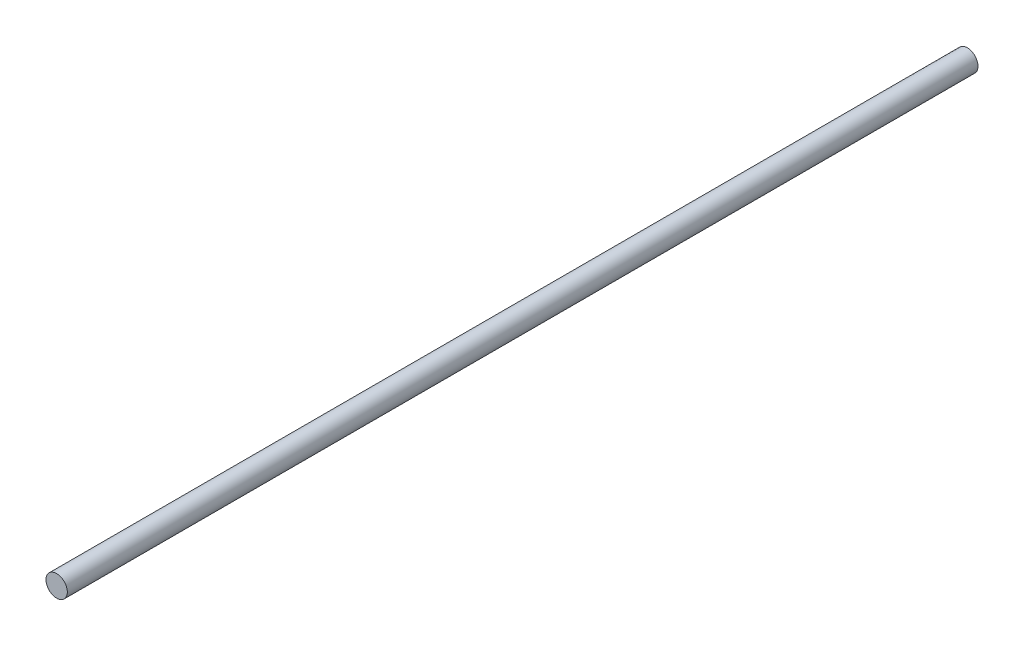
ISO-10303-21;
HEADER;
FILE_DESCRIPTION(('STEP AP214'),'2;1');
FILE_NAME('part.step','',(''),(''),'','','');
FILE_SCHEMA(('AUTOMOTIVE_DESIGN { 1 0 10303 214 1 1 1 1 }'));
ENDSEC;
DATA;
#1=APPLICATION_CONTEXT('core data for automotive mechanical design processes');
#2=APPLICATION_PROTOCOL_DEFINITION('international standard','automotive_design',2000,#1);
#3=PRODUCT_CONTEXT('',#1,'mechanical');
#4=PRODUCT('Part','Part','',(#3));
#5=PRODUCT_RELATED_PRODUCT_CATEGORY('part','',(#4));
#6=PRODUCT_DEFINITION_FORMATION('','',#4);
#7=PRODUCT_DEFINITION_CONTEXT('part definition',#1,'design');
#8=PRODUCT_DEFINITION('design','',#6,#7);
#9=PRODUCT_DEFINITION_SHAPE('','',#8);
#10=(LENGTH_UNIT() NAMED_UNIT(*) SI_UNIT(.MILLI.,.METRE.));
#11=(NAMED_UNIT(*) PLANE_ANGLE_UNIT() SI_UNIT($,.RADIAN.));
#12=(NAMED_UNIT(*) SI_UNIT($,.STERADIAN.) SOLID_ANGLE_UNIT());
#13=UNCERTAINTY_MEASURE_WITH_UNIT(LENGTH_MEASURE(1.E-05),#10,'distance_accuracy_value','');
#14=(GEOMETRIC_REPRESENTATION_CONTEXT(3) GLOBAL_UNCERTAINTY_ASSIGNED_CONTEXT((#13)) GLOBAL_UNIT_ASSIGNED_CONTEXT((#10,
#11,#12)) REPRESENTATION_CONTEXT('',''));
#15=CARTESIAN_POINT('',(0.,0.,0.));
#16=DIRECTION('',(0.,0.,1.));
#17=DIRECTION('',(1.,0.,0.));
#18=AXIS2_PLACEMENT_3D('',#15,#16,#17);
#19=CARTESIAN_POINT('',(0.,0.,367.));
#20=DIRECTION('',(0.,0.,-1.));
#21=DIRECTION('',(-1.,0.,0.));
#22=AXIS2_PLACEMENT_3D('',#19,#20,#21);
#23=CYLINDRICAL_SURFACE('',#22,4.3);
#24=CARTESIAN_POINT('',(0.,0.,367.));
#25=DIRECTION('',(0.,0.,1.));
#26=DIRECTION('',(1.,0.,0.));
#27=AXIS2_PLACEMENT_3D('',#24,#25,#26);
#28=CIRCLE('',#27,4.3);
#29=CARTESIAN_POINT('',(4.3,0.,367.));
#30=VERTEX_POINT('',#29);
#31=EDGE_CURVE('E10',#30,#30,#28,.T.);
#32=ORIENTED_EDGE('',*,*,#31,.F.);
#33=EDGE_LOOP('',(#32));
#34=FACE_BOUND('',#33,.T.);
#35=CARTESIAN_POINT('',(0.,0.,0.));
#36=DIRECTION('',(0.,0.,1.));
#37=DIRECTION('',(1.,0.,0.));
#38=AXIS2_PLACEMENT_3D('',#35,#36,#37);
#39=CIRCLE('',#38,4.3);
#40=CARTESIAN_POINT('',(4.3,0.,0.));
#41=VERTEX_POINT('',#40);
#42=EDGE_CURVE('E37',#41,#41,#39,.T.);
#43=ORIENTED_EDGE('',*,*,#42,.T.);
#44=EDGE_LOOP('',(#43));
#45=FACE_BOUND('',#44,.T.);
#46=ADVANCED_FACE('F34',(#34,#45),#23,.T.);
#47=CARTESIAN_POINT('',(0.,0.,367.));
#48=DIRECTION('',(0.,0.,1.));
#49=DIRECTION('',(1.,0.,0.));
#50=AXIS2_PLACEMENT_3D('',#47,#48,#49);
#51=PLANE('',#50);
#52=ORIENTED_EDGE('',*,*,#31,.T.);
#53=EDGE_LOOP('',(#52));
#54=FACE_BOUND('',#53,.T.);
#55=ADVANCED_FACE('F49',(#54),#51,.T.);
#56=CARTESIAN_POINT('',(0.,0.,0.));
#57=DIRECTION('',(0.,0.,1.));
#58=DIRECTION('',(1.,0.,0.));
#59=AXIS2_PLACEMENT_3D('',#56,#57,#58);
#60=PLANE('',#59);
#61=ORIENTED_EDGE('',*,*,#42,.F.);
#62=EDGE_LOOP('',(#61));
#63=FACE_BOUND('',#62,.T.);
#64=ADVANCED_FACE('F47',(#63),#60,.F.);
#65=CLOSED_SHELL('',(#46,#55,#64));
#66=MANIFOLD_SOLID_BREP('B2',#65);
#67=ADVANCED_BREP_SHAPE_REPRESENTATION('',(#18,#66),#14);
#68=SHAPE_DEFINITION_REPRESENTATION(#9,#67);
ENDSEC;
END-ISO-10303-21;
